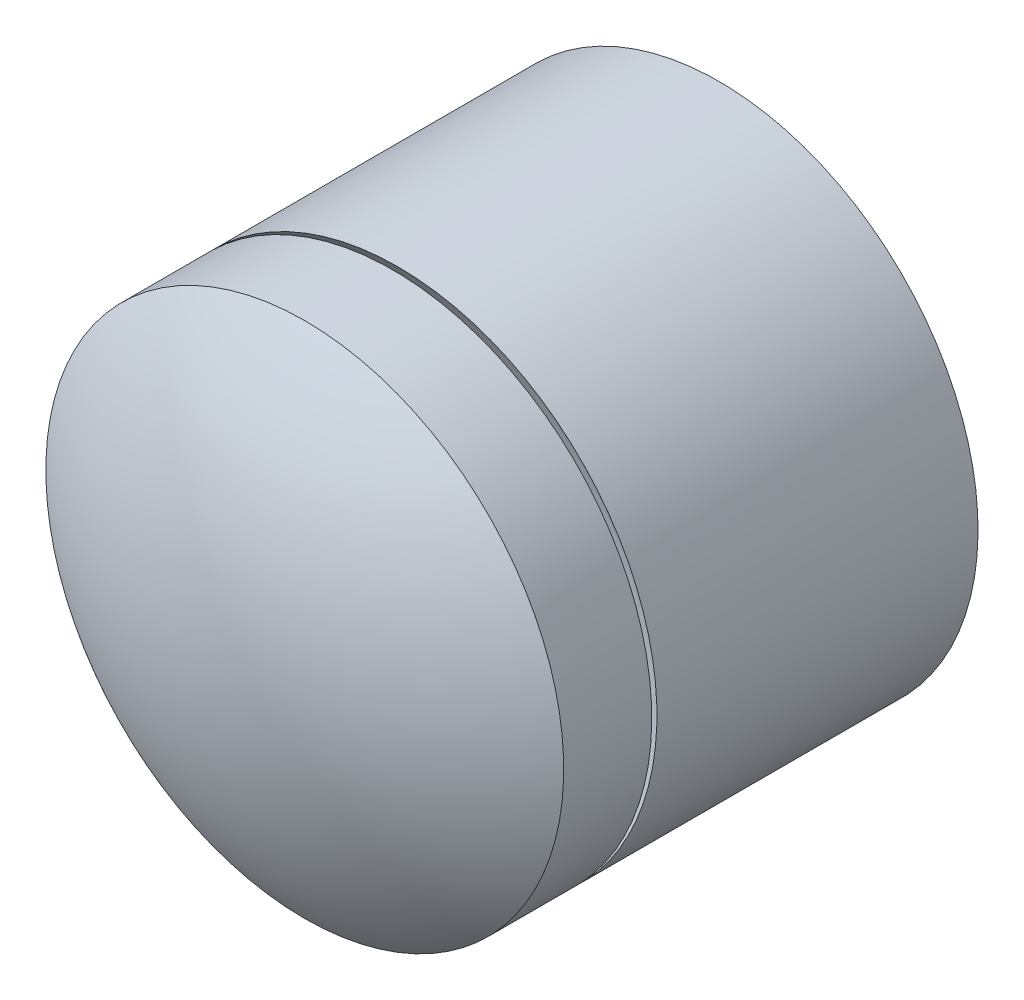
ISO-10303-21;
HEADER;
FILE_DESCRIPTION(('STEP AP214'),'2;1');
FILE_NAME('part.step','',(''),(''),'','','');
FILE_SCHEMA(('AUTOMOTIVE_DESIGN { 1 0 10303 214 1 1 1 1 }'));
ENDSEC;
DATA;
#1=APPLICATION_CONTEXT('core data for automotive mechanical design processes');
#2=APPLICATION_PROTOCOL_DEFINITION('international standard','automotive_design',2000,#1);
#3=PRODUCT_CONTEXT('',#1,'mechanical');
#4=PRODUCT('Part','Part','',(#3));
#5=PRODUCT_RELATED_PRODUCT_CATEGORY('part','',(#4));
#6=PRODUCT_DEFINITION_FORMATION('','',#4);
#7=PRODUCT_DEFINITION_CONTEXT('part definition',#1,'design');
#8=PRODUCT_DEFINITION('design','',#6,#7);
#9=PRODUCT_DEFINITION_SHAPE('','',#8);
#10=(LENGTH_UNIT() NAMED_UNIT(*) SI_UNIT(.MILLI.,.METRE.));
#11=(NAMED_UNIT(*) PLANE_ANGLE_UNIT() SI_UNIT($,.RADIAN.));
#12=(NAMED_UNIT(*) SI_UNIT($,.STERADIAN.) SOLID_ANGLE_UNIT());
#13=UNCERTAINTY_MEASURE_WITH_UNIT(LENGTH_MEASURE(1.E-05),#10,'distance_accuracy_value','');
#14=(GEOMETRIC_REPRESENTATION_CONTEXT(3) GLOBAL_UNCERTAINTY_ASSIGNED_CONTEXT((#13)) GLOBAL_UNIT_ASSIGNED_CONTEXT((#10,
#11,#12)) REPRESENTATION_CONTEXT('',''));
#15=CARTESIAN_POINT('',(0.,0.,0.));
#16=DIRECTION('',(0.,0.,1.));
#17=DIRECTION('',(1.,0.,0.));
#18=AXIS2_PLACEMENT_3D('',#15,#16,#17);
#19=CARTESIAN_POINT('',(0.,0.,6.39199136993871));
#20=DIRECTION('',(0.,0.,1.));
#21=DIRECTION('',(0.,-1.,0.));
#22=AXIS2_PLACEMENT_3D('',#19,#20,#21);
#23=SPHERICAL_SURFACE('',#22,7.39);
#24=CARTESIAN_POINT('',(0.,0.,-0.930037037545104));
#25=DIRECTION('',(0.,0.,1.));
#26=DIRECTION('',(0.,-1.,0.));
#27=AXIS2_PLACEMENT_3D('',#24,#25,#26);
#28=CIRCLE('',#27,0.999999999999999);
#29=CARTESIAN_POINT('',(0.,-0.999999999999999,-0.930037037545104));
#30=VERTEX_POINT('',#29);
#31=EDGE_CURVE('E11',#30,#30,#28,.T.);
#32=ORIENTED_EDGE('',*,*,#31,.F.);
#33=EDGE_LOOP('',(#32));
#34=FACE_BOUND('',#33,.T.);
#35=ADVANCED_FACE('F40',(#34),#23,.T.);
#36=CARTESIAN_POINT('',(0.,0.,1.));
#37=DIRECTION('',(0.,0.,1.));
#38=DIRECTION('',(0.,-1.,0.));
#39=AXIS2_PLACEMENT_3D('',#36,#37,#38);
#40=CYLINDRICAL_SURFACE('',#39,1.);
#41=CARTESIAN_POINT('',(0.,0.,0.310037037545103));
#42=DIRECTION('',(0.,0.,1.));
#43=DIRECTION('',(0.,-1.,0.));
#44=AXIS2_PLACEMENT_3D('',#41,#42,#43);
#45=CIRCLE('',#44,1.);
#46=CARTESIAN_POINT('',(0.,-1.,0.310037037545102));
#47=VERTEX_POINT('',#46);
#48=EDGE_CURVE('E46',#47,#47,#45,.T.);
#49=ORIENTED_EDGE('',*,*,#48,.F.);
#50=EDGE_LOOP('',(#49));
#51=FACE_BOUND('',#50,.T.);
#52=ORIENTED_EDGE('',*,*,#31,.T.);
#53=EDGE_LOOP('',(#52));
#54=FACE_BOUND('',#53,.T.);
#55=ADVANCED_FACE('F54',(#51,#54),#40,.T.);
#56=CARTESIAN_POINT('',(0.,0.,1.66));
#57=DIRECTION('',(0.,0.,1.));
#58=DIRECTION('',(0.,1.,0.));
#59=AXIS2_PLACEMENT_3D('',#56,#57,#58);
#60=SPHERICAL_SURFACE('',#59,1.68);
#61=ORIENTED_EDGE('',*,*,#48,.T.);
#62=EDGE_LOOP('',(#61));
#63=FACE_BOUND('',#62,.T.);
#64=ADVANCED_FACE('F52',(#63),#60,.F.);
#65=CLOSED_SHELL('',(#35,#55,#64));
#66=MANIFOLD_SOLID_BREP('B2',#65);
#67=CARTESIAN_POINT('',(0.,0.,-0.68));
#68=DIRECTION('',(0.,0.,1.));
#69=DIRECTION('',(0.,1.,0.));
#70=AXIS2_PLACEMENT_3D('',#67,#68,#69);
#71=SPHERICAL_SURFACE('',#70,1.68);
#72=CARTESIAN_POINT('',(0.,0.,0.669962962454896));
#73=DIRECTION('',(0.,0.,1.));
#74=DIRECTION('',(0.,-1.,0.));
#75=AXIS2_PLACEMENT_3D('',#72,#73,#74);
#76=CIRCLE('',#75,1.);
#77=CARTESIAN_POINT('',(0.,-1.,0.669962962454896));
#78=VERTEX_POINT('',#77);
#79=EDGE_CURVE('E86',#78,#78,#76,.T.);
#80=ORIENTED_EDGE('',*,*,#79,.T.);
#81=EDGE_LOOP('',(#80));
#82=FACE_BOUND('',#81,.T.);
#83=ADVANCED_FACE('F80',(#82),#71,.T.);
#84=CARTESIAN_POINT('',(0.,0.,1.68));
#85=DIRECTION('',(0.,0.,1.));
#86=DIRECTION('',(0.,-1.,0.));
#87=AXIS2_PLACEMENT_3D('',#84,#85,#86);
#88=SPHERICAL_SURFACE('',#87,1.68);
#89=CARTESIAN_POINT('',(0.,0.,0.330037037545103));
#90=DIRECTION('',(0.,0.,1.));
#91=DIRECTION('',(0.,-1.,0.));
#92=AXIS2_PLACEMENT_3D('',#89,#90,#91);
#93=CIRCLE('',#92,1.);
#94=CARTESIAN_POINT('',(0.,-1.,0.330037037545102));
#95=VERTEX_POINT('',#94);
#96=EDGE_CURVE('E39',#95,#95,#93,.T.);
#97=ORIENTED_EDGE('',*,*,#96,.F.);
#98=EDGE_LOOP('',(#97));
#99=FACE_BOUND('',#98,.T.);
#100=ADVANCED_FACE('F95',(#99),#88,.T.);
#101=CARTESIAN_POINT('',(0.,0.,1.));
#102=DIRECTION('',(0.,0.,1.));
#103=DIRECTION('',(0.,-1.,0.));
#104=AXIS2_PLACEMENT_3D('',#101,#102,#103);
#105=CYLINDRICAL_SURFACE('',#104,1.);
#106=ORIENTED_EDGE('',*,*,#79,.F.);
#107=EDGE_LOOP('',(#106));
#108=FACE_BOUND('',#107,.T.);
#109=ORIENTED_EDGE('',*,*,#96,.T.);
#110=EDGE_LOOP('',(#109));
#111=FACE_BOUND('',#110,.T.);
#112=ADVANCED_FACE('F93',(#108,#111),#105,.T.);
#113=CLOSED_SHELL('',(#83,#100,#112));
#114=MANIFOLD_SOLID_BREP('B6',#113);
#115=ADVANCED_BREP_SHAPE_REPRESENTATION('',(#18,#66,#114),#14);
#116=SHAPE_DEFINITION_REPRESENTATION(#9,#115);
ENDSEC;
END-ISO-10303-21;
